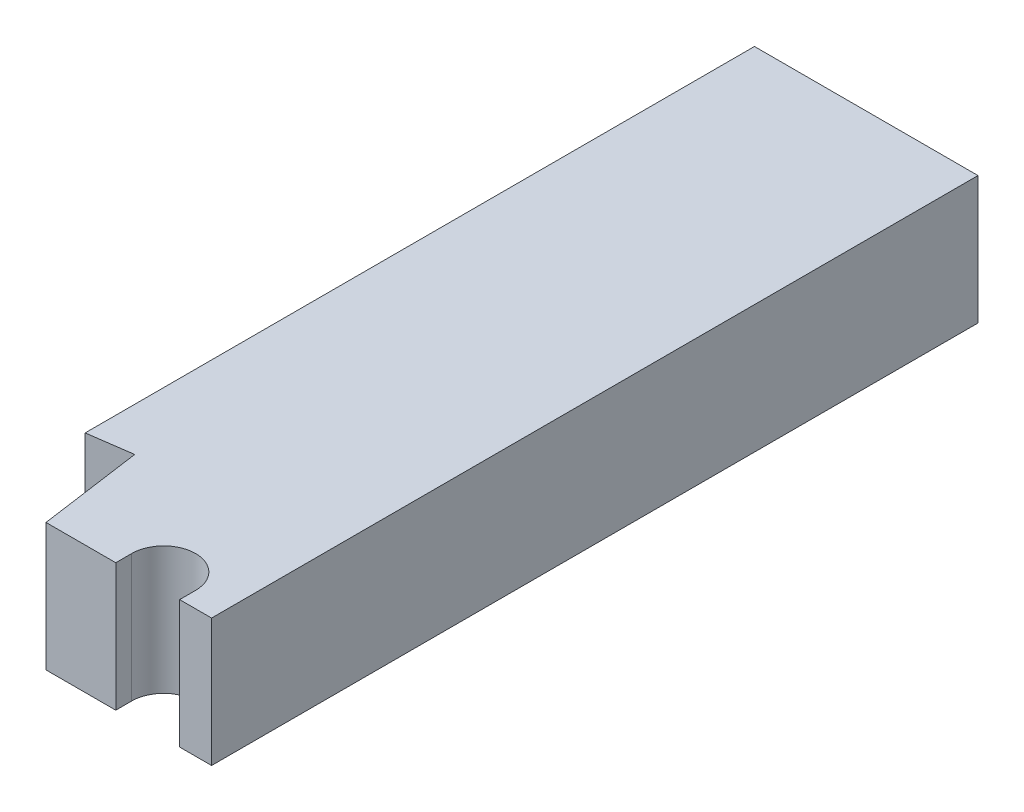
ISO-10303-21;
HEADER;
FILE_DESCRIPTION(('STEP AP214'),'2;1');
FILE_NAME('part.step','',(''),(''),'','','');
FILE_SCHEMA(('AUTOMOTIVE_DESIGN { 1 0 10303 214 1 1 1 1 }'));
ENDSEC;
DATA;
#1=APPLICATION_CONTEXT('core data for automotive mechanical design processes');
#2=APPLICATION_PROTOCOL_DEFINITION('international standard','automotive_design',2000,#1);
#3=PRODUCT_CONTEXT('',#1,'mechanical');
#4=PRODUCT('Part','Part','',(#3));
#5=PRODUCT_RELATED_PRODUCT_CATEGORY('part','',(#4));
#6=PRODUCT_DEFINITION_FORMATION('','',#4);
#7=PRODUCT_DEFINITION_CONTEXT('part definition',#1,'design');
#8=PRODUCT_DEFINITION('design','',#6,#7);
#9=PRODUCT_DEFINITION_SHAPE('','',#8);
#10=(LENGTH_UNIT() NAMED_UNIT(*) SI_UNIT(.MILLI.,.METRE.));
#11=(NAMED_UNIT(*) PLANE_ANGLE_UNIT() SI_UNIT($,.RADIAN.));
#12=(NAMED_UNIT(*) SI_UNIT($,.STERADIAN.) SOLID_ANGLE_UNIT());
#13=UNCERTAINTY_MEASURE_WITH_UNIT(LENGTH_MEASURE(1.E-05),#10,'distance_accuracy_value','');
#14=(GEOMETRIC_REPRESENTATION_CONTEXT(3) GLOBAL_UNCERTAINTY_ASSIGNED_CONTEXT((#13)) GLOBAL_UNIT_ASSIGNED_CONTEXT((#10,
#11,#12)) REPRESENTATION_CONTEXT('',''));
#15=CARTESIAN_POINT('',(0.,0.,0.));
#16=DIRECTION('',(0.,0.,1.));
#17=DIRECTION('',(1.,0.,0.));
#18=AXIS2_PLACEMENT_3D('',#15,#16,#17);
#19=CARTESIAN_POINT('',(-50.8,25.4,304.8));
#20=DIRECTION('',(0.,-1.,0.));
#21=DIRECTION('',(0.,0.,-1.));
#22=AXIS2_PLACEMENT_3D('',#19,#20,#21);
#23=PLANE('',#22);
#24=DIRECTION('',(-1.,0.,0.));
#25=VECTOR('',#24,1.);
#26=CARTESIAN_POINT('',(-50.8,25.4,304.8));
#27=LINE('',#26,#25);
#28=CARTESIAN_POINT('',(38.1,25.4,304.8));
#29=VERTEX_POINT('',#28);
#30=CARTESIAN_POINT('',(25.4,25.4,304.8));
#31=VERTEX_POINT('',#30);
#32=EDGE_CURVE('E150',#29,#31,#27,.T.);
#33=ORIENTED_EDGE('',*,*,#32,.F.);
#34=DIRECTION('',(0.,0.,1.));
#35=VECTOR('',#34,1.);
#36=CARTESIAN_POINT('',(38.1,25.4,0.));
#37=LINE('',#36,#35);
#38=CARTESIAN_POINT('',(38.1,25.4,0.));
#39=VERTEX_POINT('',#38);
#40=EDGE_CURVE('E216',#39,#29,#37,.T.);
#41=ORIENTED_EDGE('',*,*,#40,.F.);
#42=DIRECTION('',(-1.,0.,0.));
#43=VECTOR('',#42,1.);
#44=CARTESIAN_POINT('',(-50.8,25.4,0.));
#45=LINE('',#44,#43);
#46=CARTESIAN_POINT('',(-50.8,25.4,0.));
#47=VERTEX_POINT('',#46);
#48=EDGE_CURVE('E141',#39,#47,#45,.T.);
#49=ORIENTED_EDGE('',*,*,#48,.T.);
#50=DIRECTION('',(0.,0.,-1.));
#51=VECTOR('',#50,1.);
#52=CARTESIAN_POINT('',(-50.8,25.4,304.8));
#53=LINE('',#52,#51);
#54=CARTESIAN_POINT('',(-50.8,25.4,266.179092730094));
#55=VERTEX_POINT('',#54);
#56=EDGE_CURVE('E11',#55,#47,#53,.T.);
#57=ORIENTED_EDGE('',*,*,#56,.F.);
#58=DIRECTION('',(0.99026806874157,0.,-0.139173100960066));
#59=VECTOR('',#58,1.);
#60=CARTESIAN_POINT('',(-56.1226823795652,25.4,266.927146954574));
#61=LINE('',#60,#59);
#62=CARTESIAN_POINT('',(-33.5174983821929,25.4,263.750195526982));
#63=VERTEX_POINT('',#62);
#64=EDGE_CURVE('E160',#55,#63,#61,.T.);
#65=ORIENTED_EDGE('',*,*,#64,.T.);
#66=DIRECTION('',(-0.139173100960066,0.,-0.99026806874157));
#67=VECTOR('',#66,1.);
#68=CARTESIAN_POINT('',(-28.1948160026276,25.4,301.623048572408));
#69=LINE('',#68,#67);
#70=CARTESIAN_POINT('',(-27.7483245971849,25.4,304.8));
#71=VERTEX_POINT('',#70);
#72=EDGE_CURVE('E171',#71,#63,#69,.T.);
#73=ORIENTED_EDGE('',*,*,#72,.F.);
#74=CARTESIAN_POINT('',(0.,25.4,304.8));
#75=VERTEX_POINT('',#74);
#76=EDGE_CURVE('E146',#75,#71,#27,.T.);
#77=ORIENTED_EDGE('',*,*,#76,.F.);
#78=DIRECTION('',(0.,0.,-1.));
#79=VECTOR('',#78,1.);
#80=CARTESIAN_POINT('',(0.,25.4,304.8));
#81=LINE('',#80,#79);
#82=CARTESIAN_POINT('',(0.,25.4,298.45));
#83=VERTEX_POINT('',#82);
#84=EDGE_CURVE('E164',#75,#83,#81,.T.);
#85=ORIENTED_EDGE('',*,*,#84,.T.);
#86=CARTESIAN_POINT('',(12.7,25.4,298.45));
#87=DIRECTION('',(0.,1.,0.));
#88=DIRECTION('',(0.,0.,1.));
#89=AXIS2_PLACEMENT_3D('',#86,#87,#88);
#90=CIRCLE('',#89,12.7);
#91=CARTESIAN_POINT('',(25.4,25.4,298.45));
#92=VERTEX_POINT('',#91);
#93=EDGE_CURVE('E41',#92,#83,#90,.T.);
#94=ORIENTED_EDGE('',*,*,#93,.F.);
#95=DIRECTION('',(0.,0.,-1.));
#96=VECTOR('',#95,1.);
#97=CARTESIAN_POINT('',(25.4,25.4,304.8));
#98=LINE('',#97,#96);
#99=EDGE_CURVE('E168',#31,#92,#98,.T.);
#100=ORIENTED_EDGE('',*,*,#99,.F.);
#101=EDGE_LOOP('',(#33,#41,#49,#57,#65,#73,#77,#85,#94,#100));
#102=FACE_BOUND('',#101,.T.);
#103=ADVANCED_FACE('F38',(#102),#23,.F.);
#104=CARTESIAN_POINT('',(-50.8,-25.4,304.8));
#105=DIRECTION('',(0.,1.,0.));
#106=DIRECTION('',(0.,0.,1.));
#107=AXIS2_PLACEMENT_3D('',#104,#105,#106);
#108=PLANE('',#107);
#109=DIRECTION('',(1.,0.,0.));
#110=VECTOR('',#109,1.);
#111=CARTESIAN_POINT('',(-50.8,-25.4,0.));
#112=LINE('',#111,#110);
#113=CARTESIAN_POINT('',(-50.8,-25.4,0.));
#114=VERTEX_POINT('',#113);
#115=CARTESIAN_POINT('',(38.1,-25.4,0.));
#116=VERTEX_POINT('',#115);
#117=EDGE_CURVE('E125',#114,#116,#112,.T.);
#118=ORIENTED_EDGE('',*,*,#117,.T.);
#119=DIRECTION('',(0.,0.,1.));
#120=VECTOR('',#119,1.);
#121=CARTESIAN_POINT('',(38.1,-25.4,0.));
#122=LINE('',#121,#120);
#123=CARTESIAN_POINT('',(38.1,-25.4,304.8));
#124=VERTEX_POINT('',#123);
#125=EDGE_CURVE('E54',#116,#124,#122,.T.);
#126=ORIENTED_EDGE('',*,*,#125,.T.);
#127=DIRECTION('',(1.,0.,0.));
#128=VECTOR('',#127,1.);
#129=CARTESIAN_POINT('',(-50.8,-25.4,304.8));
#130=LINE('',#129,#128);
#131=CARTESIAN_POINT('',(25.4,-25.4,304.8));
#132=VERTEX_POINT('',#131);
#133=EDGE_CURVE('E155',#132,#124,#130,.T.);
#134=ORIENTED_EDGE('',*,*,#133,.F.);
#135=DIRECTION('',(0.,0.,1.));
#136=VECTOR('',#135,1.);
#137=CARTESIAN_POINT('',(25.4,-25.4,0.));
#138=LINE('',#137,#136);
#139=CARTESIAN_POINT('',(25.4,-25.4,298.45));
#140=VERTEX_POINT('',#139);
#141=EDGE_CURVE('E63',#140,#132,#138,.T.);
#142=ORIENTED_EDGE('',*,*,#141,.F.);
#143=CARTESIAN_POINT('',(12.7,-25.4,298.45));
#144=DIRECTION('',(0.,1.,0.));
#145=DIRECTION('',(0.,0.,1.));
#146=AXIS2_PLACEMENT_3D('',#143,#144,#145);
#147=CIRCLE('',#146,12.7);
#148=CARTESIAN_POINT('',(0.,-25.4,298.45));
#149=VERTEX_POINT('',#148);
#150=EDGE_CURVE('E205',#140,#149,#147,.T.);
#151=ORIENTED_EDGE('',*,*,#150,.T.);
#152=DIRECTION('',(0.,0.,1.));
#153=VECTOR('',#152,1.);
#154=CARTESIAN_POINT('',(0.,-25.4,0.));
#155=LINE('',#154,#153);
#156=CARTESIAN_POINT('',(0.,-25.4,304.8));
#157=VERTEX_POINT('',#156);
#158=EDGE_CURVE('E198',#149,#157,#155,.T.);
#159=ORIENTED_EDGE('',*,*,#158,.T.);
#160=CARTESIAN_POINT('',(-27.7483245971849,-25.4,304.8));
#161=VERTEX_POINT('',#160);
#162=EDGE_CURVE('E132',#161,#157,#130,.T.);
#163=ORIENTED_EDGE('',*,*,#162,.F.);
#164=DIRECTION('',(0.139173100960066,0.,0.99026806874157));
#165=VECTOR('',#164,1.);
#166=CARTESIAN_POINT('',(-69.2179961059717,-25.4,9.72795494916018));
#167=LINE('',#166,#165);
#168=CARTESIAN_POINT('',(-33.5174983821929,-25.4,263.750195526982));
#169=VERTEX_POINT('',#168);
#170=EDGE_CURVE('E187',#169,#161,#167,.T.);
#171=ORIENTED_EDGE('',*,*,#170,.F.);
#172=DIRECTION('',(-0.99026806874157,0.,0.139173100960066));
#173=VECTOR('',#172,1.);
#174=CARTESIAN_POINT('',(35.700497723779,-25.4,254.022240577822));
#175=LINE('',#174,#173);
#176=CARTESIAN_POINT('',(-50.8,-25.4,266.179092730094));
#177=VERTEX_POINT('',#176);
#178=EDGE_CURVE('E128',#169,#177,#175,.T.);
#179=ORIENTED_EDGE('',*,*,#178,.T.);
#180=DIRECTION('',(0.,0.,-1.));
#181=VECTOR('',#180,1.);
#182=CARTESIAN_POINT('',(-50.8,-25.4,304.8));
#183=LINE('',#182,#181);
#184=EDGE_CURVE('E47',#177,#114,#183,.T.);
#185=ORIENTED_EDGE('',*,*,#184,.T.);
#186=EDGE_LOOP('',(#118,#126,#134,#142,#151,#159,#163,#171,#179,#185));
#187=FACE_BOUND('',#186,.T.);
#188=ADVANCED_FACE('F123',(#187),#108,.F.);
#189=CARTESIAN_POINT('',(0.,0.,304.8));
#190=DIRECTION('',(0.,0.,1.));
#191=DIRECTION('',(1.,0.,0.));
#192=AXIS2_PLACEMENT_3D('',#189,#190,#191);
#193=PLANE('',#192);
#194=DIRECTION('',(0.,1.,0.));
#195=VECTOR('',#194,1.);
#196=CARTESIAN_POINT('',(38.1,-25.4,304.8));
#197=LINE('',#196,#195);
#198=EDGE_CURVE('E190',#124,#29,#197,.T.);
#199=ORIENTED_EDGE('',*,*,#198,.T.);
#200=ORIENTED_EDGE('',*,*,#32,.T.);
#201=DIRECTION('',(0.,1.,0.));
#202=VECTOR('',#201,1.);
#203=CARTESIAN_POINT('',(25.4,-25.4,304.8));
#204=LINE('',#203,#202);
#205=EDGE_CURVE('E195',#132,#31,#204,.T.);
#206=ORIENTED_EDGE('',*,*,#205,.F.);
#207=ORIENTED_EDGE('',*,*,#133,.T.);
#208=EDGE_LOOP('',(#199,#200,#206,#207));
#209=FACE_BOUND('',#208,.T.);
#210=ADVANCED_FACE('F224',(#209),#193,.T.);
#211=DIRECTION('',(0.,1.,0.));
#212=VECTOR('',#211,1.);
#213=CARTESIAN_POINT('',(0.,-25.4,304.8));
#214=LINE('',#213,#212);
#215=EDGE_CURVE('E174',#157,#75,#214,.T.);
#216=ORIENTED_EDGE('',*,*,#215,.T.);
#217=ORIENTED_EDGE('',*,*,#76,.T.);
#218=DIRECTION('',(0.,1.,0.));
#219=VECTOR('',#218,1.);
#220=CARTESIAN_POINT('',(-27.7483245971849,-25.4,304.8));
#221=LINE('',#220,#219);
#222=EDGE_CURVE('E182',#161,#71,#221,.T.);
#223=ORIENTED_EDGE('',*,*,#222,.F.);
#224=ORIENTED_EDGE('',*,*,#162,.T.);
#225=EDGE_LOOP('',(#216,#217,#223,#224));
#226=FACE_BOUND('',#225,.T.);
#227=ADVANCED_FACE('F239',(#226),#193,.T.);
#228=CARTESIAN_POINT('',(-50.8,25.4,304.8));
#229=DIRECTION('',(1.,0.,0.));
#230=DIRECTION('',(0.,1.,0.));
#231=AXIS2_PLACEMENT_3D('',#228,#229,#230);
#232=PLANE('',#231);
#233=ORIENTED_EDGE('',*,*,#184,.F.);
#234=DIRECTION('',(0.,1.,0.));
#235=VECTOR('',#234,1.);
#236=CARTESIAN_POINT('',(-50.8,-25.4,266.179092730094));
#237=LINE('',#236,#235);
#238=EDGE_CURVE('E179',#177,#55,#237,.T.);
#239=ORIENTED_EDGE('',*,*,#238,.T.);
#240=ORIENTED_EDGE('',*,*,#56,.T.);
#241=DIRECTION('',(0.,-1.,0.));
#242=VECTOR('',#241,1.);
#243=CARTESIAN_POINT('',(-50.8,25.4,0.));
#244=LINE('',#243,#242);
#245=EDGE_CURVE('E135',#47,#114,#244,.T.);
#246=ORIENTED_EDGE('',*,*,#245,.T.);
#247=EDGE_LOOP('',(#233,#239,#240,#246));
#248=FACE_BOUND('',#247,.T.);
#249=ADVANCED_FACE('F136',(#248),#232,.F.);
#250=CARTESIAN_POINT('',(0.,0.,0.));
#251=DIRECTION('',(0.,0.,1.));
#252=DIRECTION('',(1.,0.,0.));
#253=AXIS2_PLACEMENT_3D('',#250,#251,#252);
#254=PLANE('',#253);
#255=ORIENTED_EDGE('',*,*,#48,.F.);
#256=DIRECTION('',(0.,1.,0.));
#257=VECTOR('',#256,1.);
#258=CARTESIAN_POINT('',(38.1,-25.4,0.));
#259=LINE('',#258,#257);
#260=EDGE_CURVE('E144',#116,#39,#259,.T.);
#261=ORIENTED_EDGE('',*,*,#260,.F.);
#262=ORIENTED_EDGE('',*,*,#117,.F.);
#263=ORIENTED_EDGE('',*,*,#245,.F.);
#264=EDGE_LOOP('',(#255,#261,#262,#263));
#265=FACE_BOUND('',#264,.T.);
#266=ADVANCED_FACE('F143',(#265),#254,.F.);
#267=CARTESIAN_POINT('',(35.700497723779,-25.4,254.022240577822));
#268=DIRECTION('',(-0.139173100960066,0.,-0.99026806874157));
#269=DIRECTION('',(-0.99026806874157,0.,0.139173100960066));
#270=AXIS2_PLACEMENT_3D('',#267,#268,#269);
#271=PLANE('',#270);
#272=ORIENTED_EDGE('',*,*,#238,.F.);
#273=ORIENTED_EDGE('',*,*,#178,.F.);
#274=DIRECTION('',(0.,1.,0.));
#275=VECTOR('',#274,1.);
#276=CARTESIAN_POINT('',(-33.5174983821929,-25.4,263.750195526982));
#277=LINE('',#276,#275);
#278=EDGE_CURVE('E175',#169,#63,#277,.T.);
#279=ORIENTED_EDGE('',*,*,#278,.T.);
#280=ORIENTED_EDGE('',*,*,#64,.F.);
#281=EDGE_LOOP('',(#272,#273,#279,#280));
#282=FACE_BOUND('',#281,.T.);
#283=ADVANCED_FACE('F245',(#282),#271,.F.);
#284=CARTESIAN_POINT('',(-69.2179961059717,-25.4,9.72795494916018));
#285=DIRECTION('',(-0.99026806874157,0.,0.139173100960066));
#286=DIRECTION('',(0.139173100960066,0.,0.99026806874157));
#287=AXIS2_PLACEMENT_3D('',#284,#285,#286);
#288=PLANE('',#287);
#289=ORIENTED_EDGE('',*,*,#72,.T.);
#290=ORIENTED_EDGE('',*,*,#278,.F.);
#291=ORIENTED_EDGE('',*,*,#170,.T.);
#292=ORIENTED_EDGE('',*,*,#222,.T.);
#293=EDGE_LOOP('',(#289,#290,#291,#292));
#294=FACE_BOUND('',#293,.T.);
#295=ADVANCED_FACE('F243',(#294),#288,.T.);
#296=CARTESIAN_POINT('',(12.7,-25.4,298.45));
#297=DIRECTION('',(0.,1.,0.));
#298=DIRECTION('',(0.,0.,1.));
#299=AXIS2_PLACEMENT_3D('',#296,#297,#298);
#300=CYLINDRICAL_SURFACE('',#299,12.7);
#301=DIRECTION('',(0.,1.,0.));
#302=VECTOR('',#301,1.);
#303=CARTESIAN_POINT('',(0.,-25.4,298.45));
#304=LINE('',#303,#302);
#305=EDGE_CURVE('E80',#149,#83,#304,.T.);
#306=ORIENTED_EDGE('',*,*,#305,.F.);
#307=ORIENTED_EDGE('',*,*,#150,.F.);
#308=DIRECTION('',(0.,1.,0.));
#309=VECTOR('',#308,1.);
#310=CARTESIAN_POINT('',(25.4,-25.4,298.45));
#311=LINE('',#310,#309);
#312=EDGE_CURVE('E85',#140,#92,#311,.T.);
#313=ORIENTED_EDGE('',*,*,#312,.T.);
#314=ORIENTED_EDGE('',*,*,#93,.T.);
#315=EDGE_LOOP('',(#306,#307,#313,#314));
#316=FACE_BOUND('',#315,.T.);
#317=ADVANCED_FACE('F234',(#316),#300,.F.);
#318=CARTESIAN_POINT('',(0.,-25.4,0.));
#319=DIRECTION('',(-1.,0.,0.));
#320=DIRECTION('',(0.,0.,1.));
#321=AXIS2_PLACEMENT_3D('',#318,#319,#320);
#322=PLANE('',#321);
#323=ORIENTED_EDGE('',*,*,#215,.F.);
#324=ORIENTED_EDGE('',*,*,#158,.F.);
#325=ORIENTED_EDGE('',*,*,#305,.T.);
#326=ORIENTED_EDGE('',*,*,#84,.F.);
#327=EDGE_LOOP('',(#323,#324,#325,#326));
#328=FACE_BOUND('',#327,.T.);
#329=ADVANCED_FACE('F311',(#328),#322,.F.);
#330=CARTESIAN_POINT('',(25.4,-25.4,0.));
#331=DIRECTION('',(-1.,0.,0.));
#332=DIRECTION('',(0.,0.,1.));
#333=AXIS2_PLACEMENT_3D('',#330,#331,#332);
#334=PLANE('',#333);
#335=ORIENTED_EDGE('',*,*,#99,.T.);
#336=ORIENTED_EDGE('',*,*,#312,.F.);
#337=ORIENTED_EDGE('',*,*,#141,.T.);
#338=ORIENTED_EDGE('',*,*,#205,.T.);
#339=EDGE_LOOP('',(#335,#336,#337,#338));
#340=FACE_BOUND('',#339,.T.);
#341=ADVANCED_FACE('F227',(#340),#334,.T.);
#342=CARTESIAN_POINT('',(38.1,-25.4,0.));
#343=DIRECTION('',(-1.,0.,0.));
#344=DIRECTION('',(0.,0.,1.));
#345=AXIS2_PLACEMENT_3D('',#342,#343,#344);
#346=PLANE('',#345);
#347=ORIENTED_EDGE('',*,*,#40,.T.);
#348=ORIENTED_EDGE('',*,*,#198,.F.);
#349=ORIENTED_EDGE('',*,*,#125,.F.);
#350=ORIENTED_EDGE('',*,*,#260,.T.);
#351=EDGE_LOOP('',(#347,#348,#349,#350));
#352=FACE_BOUND('',#351,.T.);
#353=ADVANCED_FACE('F325',(#352),#346,.F.);
#354=CLOSED_SHELL('',(#103,#188,#210,#227,#249,#266,#283,#295,#317,#329,#341,#353));
#355=MANIFOLD_SOLID_BREP('B2',#354);
#356=ADVANCED_BREP_SHAPE_REPRESENTATION('',(#18,#355),#14);
#357=SHAPE_DEFINITION_REPRESENTATION(#9,#356);
ENDSEC;
END-ISO-10303-21;
